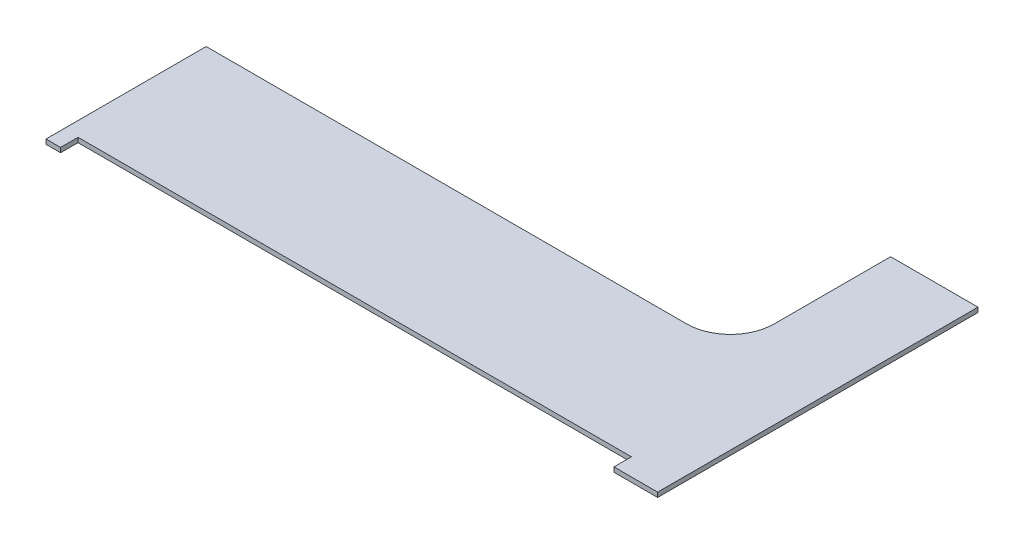
ISO-10303-21;
HEADER;
FILE_DESCRIPTION(('STEP AP214'),'2;1');
FILE_NAME('part.step','',(''),(''),'','','');
FILE_SCHEMA(('AUTOMOTIVE_DESIGN { 1 0 10303 214 1 1 1 1 }'));
ENDSEC;
DATA;
#1=APPLICATION_CONTEXT('core data for automotive mechanical design processes');
#2=APPLICATION_PROTOCOL_DEFINITION('international standard','automotive_design',2000,#1);
#3=PRODUCT_CONTEXT('',#1,'mechanical');
#4=PRODUCT('Part','Part','',(#3));
#5=PRODUCT_RELATED_PRODUCT_CATEGORY('part','',(#4));
#6=PRODUCT_DEFINITION_FORMATION('','',#4);
#7=PRODUCT_DEFINITION_CONTEXT('part definition',#1,'design');
#8=PRODUCT_DEFINITION('design','',#6,#7);
#9=PRODUCT_DEFINITION_SHAPE('','',#8);
#10=(LENGTH_UNIT() NAMED_UNIT(*) SI_UNIT(.MILLI.,.METRE.));
#11=(NAMED_UNIT(*) PLANE_ANGLE_UNIT() SI_UNIT($,.RADIAN.));
#12=(NAMED_UNIT(*) SI_UNIT($,.STERADIAN.) SOLID_ANGLE_UNIT());
#13=UNCERTAINTY_MEASURE_WITH_UNIT(LENGTH_MEASURE(1.E-05),#10,'distance_accuracy_value','');
#14=(GEOMETRIC_REPRESENTATION_CONTEXT(3) GLOBAL_UNCERTAINTY_ASSIGNED_CONTEXT((#13)) GLOBAL_UNIT_ASSIGNED_CONTEXT((#10,
#11,#12)) REPRESENTATION_CONTEXT('',''));
#15=CARTESIAN_POINT('',(0.,0.,0.));
#16=DIRECTION('',(0.,0.,1.));
#17=DIRECTION('',(1.,0.,0.));
#18=AXIS2_PLACEMENT_3D('',#15,#16,#17);
#19=CARTESIAN_POINT('',(0.,16.,0.));
#20=DIRECTION('',(0.,0.,-1.));
#21=DIRECTION('',(-1.,0.,0.));
#22=AXIS2_PLACEMENT_3D('',#19,#20,#21);
#23=PLANE('',#22);
#24=DIRECTION('',(1.,0.,0.));
#25=VECTOR('',#24,1.);
#26=CARTESIAN_POINT('',(0.,0.,0.));
#27=LINE('',#26,#25);
#28=CARTESIAN_POINT('',(0.,0.,0.));
#29=VERTEX_POINT('',#28);
#30=CARTESIAN_POINT('',(50.,0.,0.));
#31=VERTEX_POINT('',#30);
#32=EDGE_CURVE('E142',#29,#31,#27,.T.);
#33=ORIENTED_EDGE('',*,*,#32,.T.);
#34=DIRECTION('',(0.,1.,0.));
#35=VECTOR('',#34,1.);
#36=CARTESIAN_POINT('',(50.,0.,0.));
#37=LINE('',#36,#35);
#38=CARTESIAN_POINT('',(50.,16.,0.));
#39=VERTEX_POINT('',#38);
#40=EDGE_CURVE('E183',#31,#39,#37,.T.);
#41=ORIENTED_EDGE('',*,*,#40,.T.);
#42=DIRECTION('',(1.,0.,0.));
#43=VECTOR('',#42,1.);
#44=CARTESIAN_POINT('',(0.,16.,0.));
#45=LINE('',#44,#43);
#46=CARTESIAN_POINT('',(0.,16.,0.));
#47=VERTEX_POINT('',#46);
#48=EDGE_CURVE('E95',#47,#39,#45,.T.);
#49=ORIENTED_EDGE('',*,*,#48,.F.);
#50=DIRECTION('',(0.,-1.,0.));
#51=VECTOR('',#50,1.);
#52=CARTESIAN_POINT('',(0.,16.,0.));
#53=LINE('',#52,#51);
#54=EDGE_CURVE('E11',#47,#29,#53,.T.);
#55=ORIENTED_EDGE('',*,*,#54,.T.);
#56=EDGE_LOOP('',(#33,#41,#49,#55));
#57=FACE_BOUND('',#56,.T.);
#58=ADVANCED_FACE('F33',(#57),#23,.F.);
#59=CARTESIAN_POINT('',(0.,16.,0.));
#60=DIRECTION('',(1.,0.,0.));
#61=DIRECTION('',(0.,0.,-1.));
#62=AXIS2_PLACEMENT_3D('',#59,#60,#61);
#63=PLANE('',#62);
#64=DIRECTION('',(0.,0.,1.));
#65=VECTOR('',#64,1.);
#66=CARTESIAN_POINT('',(0.,0.,0.));
#67=LINE('',#66,#65);
#68=CARTESIAN_POINT('',(0.,0.,-550.));
#69=VERTEX_POINT('',#68);
#70=EDGE_CURVE('E137',#69,#29,#67,.T.);
#71=ORIENTED_EDGE('',*,*,#70,.T.);
#72=ORIENTED_EDGE('',*,*,#54,.F.);
#73=DIRECTION('',(0.,0.,1.));
#74=VECTOR('',#73,1.);
#75=CARTESIAN_POINT('',(0.,16.,0.));
#76=LINE('',#75,#74);
#77=CARTESIAN_POINT('',(0.,16.,-550.));
#78=VERTEX_POINT('',#77);
#79=EDGE_CURVE('E153',#78,#47,#76,.T.);
#80=ORIENTED_EDGE('',*,*,#79,.F.);
#81=DIRECTION('',(0.,-1.,0.));
#82=VECTOR('',#81,1.);
#83=CARTESIAN_POINT('',(0.,16.,-550.));
#84=LINE('',#83,#82);
#85=EDGE_CURVE('E133',#78,#69,#84,.T.);
#86=ORIENTED_EDGE('',*,*,#85,.T.);
#87=EDGE_LOOP('',(#71,#72,#80,#86));
#88=FACE_BOUND('',#87,.T.);
#89=ADVANCED_FACE('F35',(#88),#63,.F.);
#90=CARTESIAN_POINT('',(1950.,16.,0.));
#91=VERTEX_POINT('',#90);
#92=CARTESIAN_POINT('',(2100.,16.,0.));
#93=VERTEX_POINT('',#92);
#94=EDGE_CURVE('E181',#91,#93,#45,.T.);
#95=ORIENTED_EDGE('',*,*,#94,.F.);
#96=DIRECTION('',(0.,1.,0.));
#97=VECTOR('',#96,1.);
#98=CARTESIAN_POINT('',(1950.,0.,0.));
#99=LINE('',#98,#97);
#100=CARTESIAN_POINT('',(1950.,0.,0.));
#101=VERTEX_POINT('',#100);
#102=EDGE_CURVE('E185',#101,#91,#99,.T.);
#103=ORIENTED_EDGE('',*,*,#102,.F.);
#104=CARTESIAN_POINT('',(2100.,0.,0.));
#105=VERTEX_POINT('',#104);
#106=EDGE_CURVE('E140',#101,#105,#27,.T.);
#107=ORIENTED_EDGE('',*,*,#106,.T.);
#108=DIRECTION('',(0.,-1.,0.));
#109=VECTOR('',#108,1.);
#110=CARTESIAN_POINT('',(2100.,16.,0.));
#111=LINE('',#110,#109);
#112=EDGE_CURVE('E41',#93,#105,#111,.T.);
#113=ORIENTED_EDGE('',*,*,#112,.F.);
#114=EDGE_LOOP('',(#95,#103,#107,#113));
#115=FACE_BOUND('',#114,.T.);
#116=ADVANCED_FACE('F229',(#115),#23,.F.);
#117=CARTESIAN_POINT('',(2100.,16.,0.));
#118=DIRECTION('',(-1.,0.,0.));
#119=DIRECTION('',(0.,0.,1.));
#120=AXIS2_PLACEMENT_3D('',#117,#118,#119);
#121=PLANE('',#120);
#122=DIRECTION('',(0.,0.,-1.));
#123=VECTOR('',#122,1.);
#124=CARTESIAN_POINT('',(2100.,0.,0.));
#125=LINE('',#124,#123);
#126=CARTESIAN_POINT('',(2100.,0.,-1100.));
#127=VERTEX_POINT('',#126);
#128=EDGE_CURVE('E145',#105,#127,#125,.T.);
#129=ORIENTED_EDGE('',*,*,#128,.T.);
#130=DIRECTION('',(0.,-1.,0.));
#131=VECTOR('',#130,1.);
#132=CARTESIAN_POINT('',(2100.,16.,-1100.));
#133=LINE('',#132,#131);
#134=CARTESIAN_POINT('',(2100.,16.,-1100.));
#135=VERTEX_POINT('',#134);
#136=EDGE_CURVE('E157',#135,#127,#133,.T.);
#137=ORIENTED_EDGE('',*,*,#136,.F.);
#138=DIRECTION('',(0.,0.,-1.));
#139=VECTOR('',#138,1.);
#140=CARTESIAN_POINT('',(2100.,16.,0.));
#141=LINE('',#140,#139);
#142=EDGE_CURVE('E166',#93,#135,#141,.T.);
#143=ORIENTED_EDGE('',*,*,#142,.F.);
#144=ORIENTED_EDGE('',*,*,#112,.T.);
#145=EDGE_LOOP('',(#129,#137,#143,#144));
#146=FACE_BOUND('',#145,.T.);
#147=ADVANCED_FACE('F164',(#146),#121,.F.);
#148=CARTESIAN_POINT('',(2100.,16.,-1100.));
#149=DIRECTION('',(0.,0.,1.));
#150=DIRECTION('',(1.,0.,0.));
#151=AXIS2_PLACEMENT_3D('',#148,#149,#150);
#152=PLANE('',#151);
#153=DIRECTION('',(-1.,0.,0.));
#154=VECTOR('',#153,1.);
#155=CARTESIAN_POINT('',(2100.,0.,-1100.));
#156=LINE('',#155,#154);
#157=CARTESIAN_POINT('',(1800.,0.,-1100.));
#158=VERTEX_POINT('',#157);
#159=EDGE_CURVE('E147',#127,#158,#156,.T.);
#160=ORIENTED_EDGE('',*,*,#159,.T.);
#161=DIRECTION('',(0.,-1.,0.));
#162=VECTOR('',#161,1.);
#163=CARTESIAN_POINT('',(1800.,16.,-1100.));
#164=LINE('',#163,#162);
#165=CARTESIAN_POINT('',(1800.,16.,-1100.));
#166=VERTEX_POINT('',#165);
#167=EDGE_CURVE('E128',#166,#158,#164,.T.);
#168=ORIENTED_EDGE('',*,*,#167,.F.);
#169=DIRECTION('',(-1.,0.,0.));
#170=VECTOR('',#169,1.);
#171=CARTESIAN_POINT('',(2100.,16.,-1100.));
#172=LINE('',#171,#170);
#173=EDGE_CURVE('E116',#135,#166,#172,.T.);
#174=ORIENTED_EDGE('',*,*,#173,.F.);
#175=ORIENTED_EDGE('',*,*,#136,.T.);
#176=EDGE_LOOP('',(#160,#168,#174,#175));
#177=FACE_BOUND('',#176,.T.);
#178=ADVANCED_FACE('F177',(#177),#152,.F.);
#179=CARTESIAN_POINT('',(1800.,16.,-1100.));
#180=DIRECTION('',(1.,0.,0.));
#181=DIRECTION('',(0.,0.,-1.));
#182=AXIS2_PLACEMENT_3D('',#179,#180,#181);
#183=PLANE('',#182);
#184=DIRECTION('',(0.,0.,1.));
#185=VECTOR('',#184,1.);
#186=CARTESIAN_POINT('',(1800.,0.,-1100.));
#187=LINE('',#186,#185);
#188=CARTESIAN_POINT('',(1800.,0.,-700.));
#189=VERTEX_POINT('',#188);
#190=EDGE_CURVE('E125',#158,#189,#187,.T.);
#191=ORIENTED_EDGE('',*,*,#190,.T.);
#192=DIRECTION('',(0.,-1.,0.));
#193=VECTOR('',#192,1.);
#194=CARTESIAN_POINT('',(1800.,16.,-700.));
#195=LINE('',#194,#193);
#196=CARTESIAN_POINT('',(1800.,16.,-700.));
#197=VERTEX_POINT('',#196);
#198=EDGE_CURVE('E122',#197,#189,#195,.T.);
#199=ORIENTED_EDGE('',*,*,#198,.F.);
#200=DIRECTION('',(0.,0.,1.));
#201=VECTOR('',#200,1.);
#202=CARTESIAN_POINT('',(1800.,16.,-1100.));
#203=LINE('',#202,#201);
#204=EDGE_CURVE('E109',#166,#197,#203,.T.);
#205=ORIENTED_EDGE('',*,*,#204,.F.);
#206=ORIENTED_EDGE('',*,*,#167,.T.);
#207=EDGE_LOOP('',(#191,#199,#205,#206));
#208=FACE_BOUND('',#207,.T.);
#209=ADVANCED_FACE('F123',(#208),#183,.F.);
#210=CARTESIAN_POINT('',(1650.,16.,-700.));
#211=DIRECTION('',(0.,-1.,0.));
#212=DIRECTION('',(0.,0.,-1.));
#213=AXIS2_PLACEMENT_3D('',#210,#211,#212);
#214=CYLINDRICAL_SURFACE('',#213,150.);
#215=CARTESIAN_POINT('',(1650.,0.,-700.));
#216=DIRECTION('',(0.,-1.,0.));
#217=DIRECTION('',(0.,0.,-1.));
#218=AXIS2_PLACEMENT_3D('',#215,#216,#217);
#219=CIRCLE('',#218,150.);
#220=CARTESIAN_POINT('',(1650.,0.,-550.));
#221=VERTEX_POINT('',#220);
#222=EDGE_CURVE('E150',#189,#221,#219,.T.);
#223=ORIENTED_EDGE('',*,*,#222,.T.);
#224=DIRECTION('',(0.,-1.,0.));
#225=VECTOR('',#224,1.);
#226=CARTESIAN_POINT('',(1650.,16.,-550.));
#227=LINE('',#226,#225);
#228=CARTESIAN_POINT('',(1650.,16.,-550.));
#229=VERTEX_POINT('',#228);
#230=EDGE_CURVE('E129',#229,#221,#227,.T.);
#231=ORIENTED_EDGE('',*,*,#230,.F.);
#232=CARTESIAN_POINT('',(1650.,16.,-700.));
#233=DIRECTION('',(0.,-1.,0.));
#234=DIRECTION('',(0.,0.,-1.));
#235=AXIS2_PLACEMENT_3D('',#232,#233,#234);
#236=CIRCLE('',#235,150.);
#237=EDGE_CURVE('E113',#197,#229,#236,.T.);
#238=ORIENTED_EDGE('',*,*,#237,.F.);
#239=ORIENTED_EDGE('',*,*,#198,.T.);
#240=EDGE_LOOP('',(#223,#231,#238,#239));
#241=FACE_BOUND('',#240,.T.);
#242=ADVANCED_FACE('F131',(#241),#214,.F.);
#243=CARTESIAN_POINT('',(0.,16.,-550.));
#244=DIRECTION('',(0.,0.,1.));
#245=DIRECTION('',(1.,0.,0.));
#246=AXIS2_PLACEMENT_3D('',#243,#244,#245);
#247=PLANE('',#246);
#248=DIRECTION('',(-1.,0.,0.));
#249=VECTOR('',#248,1.);
#250=CARTESIAN_POINT('',(0.,0.,-550.));
#251=LINE('',#250,#249);
#252=EDGE_CURVE('E87',#221,#69,#251,.T.);
#253=ORIENTED_EDGE('',*,*,#252,.T.);
#254=ORIENTED_EDGE('',*,*,#85,.F.);
#255=DIRECTION('',(-1.,0.,0.));
#256=VECTOR('',#255,1.);
#257=CARTESIAN_POINT('',(0.,16.,-550.));
#258=LINE('',#257,#256);
#259=EDGE_CURVE('E57',#229,#78,#258,.T.);
#260=ORIENTED_EDGE('',*,*,#259,.F.);
#261=ORIENTED_EDGE('',*,*,#230,.T.);
#262=EDGE_LOOP('',(#253,#254,#260,#261));
#263=FACE_BOUND('',#262,.T.);
#264=ADVANCED_FACE('F215',(#263),#247,.F.);
#265=CARTESIAN_POINT('',(1650.,16.,-700.));
#266=DIRECTION('',(0.,-1.,0.));
#267=DIRECTION('',(0.,0.,-1.));
#268=AXIS2_PLACEMENT_3D('',#265,#266,#267);
#269=PLANE('',#268);
#270=ORIENTED_EDGE('',*,*,#48,.T.);
#271=DIRECTION('',(0.,0.,1.));
#272=VECTOR('',#271,1.);
#273=CARTESIAN_POINT('',(50.,16.,0.));
#274=LINE('',#273,#272);
#275=CARTESIAN_POINT('',(50.,16.,-60.));
#276=VERTEX_POINT('',#275);
#277=EDGE_CURVE('E199',#276,#39,#274,.T.);
#278=ORIENTED_EDGE('',*,*,#277,.F.);
#279=DIRECTION('',(-1.,0.,0.));
#280=VECTOR('',#279,1.);
#281=CARTESIAN_POINT('',(50.,16.,-60.));
#282=LINE('',#281,#280);
#283=CARTESIAN_POINT('',(1950.,16.,-60.));
#284=VERTEX_POINT('',#283);
#285=EDGE_CURVE('E192',#284,#276,#282,.T.);
#286=ORIENTED_EDGE('',*,*,#285,.F.);
#287=DIRECTION('',(0.,0.,-1.));
#288=VECTOR('',#287,1.);
#289=CARTESIAN_POINT('',(1950.,16.,0.));
#290=LINE('',#289,#288);
#291=EDGE_CURVE('E196',#91,#284,#290,.T.);
#292=ORIENTED_EDGE('',*,*,#291,.F.);
#293=ORIENTED_EDGE('',*,*,#94,.T.);
#294=ORIENTED_EDGE('',*,*,#142,.T.);
#295=ORIENTED_EDGE('',*,*,#173,.T.);
#296=ORIENTED_EDGE('',*,*,#204,.T.);
#297=ORIENTED_EDGE('',*,*,#237,.T.);
#298=ORIENTED_EDGE('',*,*,#259,.T.);
#299=ORIENTED_EDGE('',*,*,#79,.T.);
#300=EDGE_LOOP('',(#270,#278,#286,#292,#293,#294,#295,#296,#297,#298,#299));
#301=FACE_BOUND('',#300,.T.);
#302=ADVANCED_FACE('F111',(#301),#269,.F.);
#303=CARTESIAN_POINT('',(1650.,0.,-700.));
#304=DIRECTION('',(0.,-1.,0.));
#305=DIRECTION('',(0.,0.,-1.));
#306=AXIS2_PLACEMENT_3D('',#303,#304,#305);
#307=PLANE('',#306);
#308=DIRECTION('',(0.,0.,1.));
#309=VECTOR('',#308,1.);
#310=CARTESIAN_POINT('',(50.,0.,0.));
#311=LINE('',#310,#309);
#312=CARTESIAN_POINT('',(50.,0.,-60.));
#313=VERTEX_POINT('',#312);
#314=EDGE_CURVE('E195',#313,#31,#311,.T.);
#315=ORIENTED_EDGE('',*,*,#314,.T.);
#316=ORIENTED_EDGE('',*,*,#32,.F.);
#317=ORIENTED_EDGE('',*,*,#70,.F.);
#318=ORIENTED_EDGE('',*,*,#252,.F.);
#319=ORIENTED_EDGE('',*,*,#222,.F.);
#320=ORIENTED_EDGE('',*,*,#190,.F.);
#321=ORIENTED_EDGE('',*,*,#159,.F.);
#322=ORIENTED_EDGE('',*,*,#128,.F.);
#323=ORIENTED_EDGE('',*,*,#106,.F.);
#324=DIRECTION('',(0.,0.,-1.));
#325=VECTOR('',#324,1.);
#326=CARTESIAN_POINT('',(1950.,0.,0.));
#327=LINE('',#326,#325);
#328=CARTESIAN_POINT('',(1950.,0.,-59.9999999999999));
#329=VERTEX_POINT('',#328);
#330=EDGE_CURVE('E203',#101,#329,#327,.T.);
#331=ORIENTED_EDGE('',*,*,#330,.T.);
#332=DIRECTION('',(-1.,0.,0.));
#333=VECTOR('',#332,1.);
#334=CARTESIAN_POINT('',(50.,0.,-60.));
#335=LINE('',#334,#333);
#336=EDGE_CURVE('E48',#329,#313,#335,.T.);
#337=ORIENTED_EDGE('',*,*,#336,.T.);
#338=EDGE_LOOP('',(#315,#316,#317,#318,#319,#320,#321,#322,#323,#331,#337));
#339=FACE_BOUND('',#338,.T.);
#340=ADVANCED_FACE('F173',(#339),#307,.T.);
#341=CARTESIAN_POINT('',(50.,0.,0.));
#342=DIRECTION('',(-1.,0.,0.));
#343=DIRECTION('',(0.,0.,1.));
#344=AXIS2_PLACEMENT_3D('',#341,#342,#343);
#345=PLANE('',#344);
#346=ORIENTED_EDGE('',*,*,#277,.T.);
#347=ORIENTED_EDGE('',*,*,#40,.F.);
#348=ORIENTED_EDGE('',*,*,#314,.F.);
#349=DIRECTION('',(0.,1.,0.));
#350=VECTOR('',#349,1.);
#351=CARTESIAN_POINT('',(50.,0.,-60.));
#352=LINE('',#351,#350);
#353=EDGE_CURVE('E141',#313,#276,#352,.T.);
#354=ORIENTED_EDGE('',*,*,#353,.T.);
#355=EDGE_LOOP('',(#346,#347,#348,#354));
#356=FACE_BOUND('',#355,.T.);
#357=ADVANCED_FACE('F224',(#356),#345,.F.);
#358=CARTESIAN_POINT('',(50.,0.,-60.));
#359=DIRECTION('',(0.,0.,-1.));
#360=DIRECTION('',(-1.,0.,0.));
#361=AXIS2_PLACEMENT_3D('',#358,#359,#360);
#362=PLANE('',#361);
#363=ORIENTED_EDGE('',*,*,#285,.T.);
#364=ORIENTED_EDGE('',*,*,#353,.F.);
#365=ORIENTED_EDGE('',*,*,#336,.F.);
#366=DIRECTION('',(0.,1.,0.));
#367=VECTOR('',#366,1.);
#368=CARTESIAN_POINT('',(1950.,0.,-60.));
#369=LINE('',#368,#367);
#370=EDGE_CURVE('E188',#329,#284,#369,.T.);
#371=ORIENTED_EDGE('',*,*,#370,.T.);
#372=EDGE_LOOP('',(#363,#364,#365,#371));
#373=FACE_BOUND('',#372,.T.);
#374=ADVANCED_FACE('F225',(#373),#362,.F.);
#375=CARTESIAN_POINT('',(1950.,0.,0.));
#376=DIRECTION('',(1.,0.,0.));
#377=DIRECTION('',(0.,0.,-1.));
#378=AXIS2_PLACEMENT_3D('',#375,#376,#377);
#379=PLANE('',#378);
#380=ORIENTED_EDGE('',*,*,#291,.T.);
#381=ORIENTED_EDGE('',*,*,#370,.F.);
#382=ORIENTED_EDGE('',*,*,#330,.F.);
#383=ORIENTED_EDGE('',*,*,#102,.T.);
#384=EDGE_LOOP('',(#380,#381,#382,#383));
#385=FACE_BOUND('',#384,.T.);
#386=ADVANCED_FACE('F231',(#385),#379,.F.);
#387=CLOSED_SHELL('',(#58,#89,#116,#147,#178,#209,#242,#264,#302,#340,#357,#374,#386));
#388=MANIFOLD_SOLID_BREP('B2',#387);
#389=ADVANCED_BREP_SHAPE_REPRESENTATION('',(#18,#388),#14);
#390=SHAPE_DEFINITION_REPRESENTATION(#9,#389);
ENDSEC;
END-ISO-10303-21;
